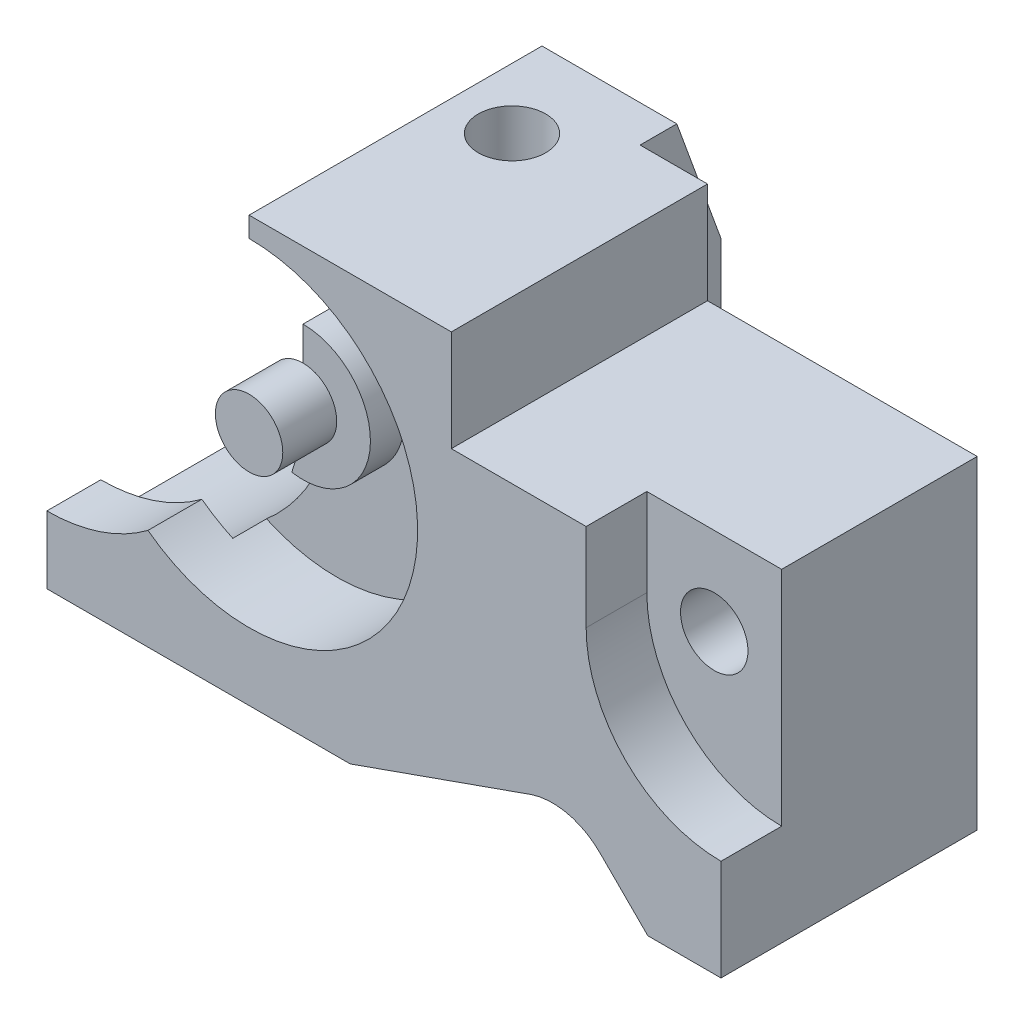
ISO-10303-21;
HEADER;
FILE_DESCRIPTION(('STEP AP214'),'2;1');
FILE_NAME('part.step','',(''),(''),'','','');
FILE_SCHEMA(('AUTOMOTIVE_DESIGN { 1 0 10303 214 1 1 1 1 }'));
ENDSEC;
DATA;
#1=APPLICATION_CONTEXT('core data for automotive mechanical design processes');
#2=APPLICATION_PROTOCOL_DEFINITION('international standard','automotive_design',2000,#1);
#3=PRODUCT_CONTEXT('',#1,'mechanical');
#4=PRODUCT('Part','Part','',(#3));
#5=PRODUCT_RELATED_PRODUCT_CATEGORY('part','',(#4));
#6=PRODUCT_DEFINITION_FORMATION('','',#4);
#7=PRODUCT_DEFINITION_CONTEXT('part definition',#1,'design');
#8=PRODUCT_DEFINITION('design','',#6,#7);
#9=PRODUCT_DEFINITION_SHAPE('','',#8);
#10=(LENGTH_UNIT() NAMED_UNIT(*) SI_UNIT(.MILLI.,.METRE.));
#11=(NAMED_UNIT(*) PLANE_ANGLE_UNIT() SI_UNIT($,.RADIAN.));
#12=(NAMED_UNIT(*) SI_UNIT($,.STERADIAN.) SOLID_ANGLE_UNIT());
#13=UNCERTAINTY_MEASURE_WITH_UNIT(LENGTH_MEASURE(1.E-05),#10,'distance_accuracy_value','');
#14=(GEOMETRIC_REPRESENTATION_CONTEXT(3) GLOBAL_UNCERTAINTY_ASSIGNED_CONTEXT((#13)) GLOBAL_UNIT_ASSIGNED_CONTEXT((#10,
#11,#12)) REPRESENTATION_CONTEXT('',''));
#15=CARTESIAN_POINT('',(0.,0.,0.));
#16=DIRECTION('',(0.,0.,1.));
#17=DIRECTION('',(1.,0.,0.));
#18=AXIS2_PLACEMENT_3D('',#15,#16,#17);
#19=CARTESIAN_POINT('',(0.,35.,50.));
#20=DIRECTION('',(0.,0.,-1.));
#21=DIRECTION('',(-1.,0.,0.));
#22=AXIS2_PLACEMENT_3D('',#19,#20,#21);
#23=CYLINDRICAL_SURFACE('',#22,30.);
#24=DIRECTION('',(0.,0.,-1.));
#25=VECTOR('',#24,1.);
#26=CARTESIAN_POINT('',(0.,5.,50.));
#27=LINE('',#26,#25);
#28=CARTESIAN_POINT('',(0.,5.,42.));
#29=VERTEX_POINT('',#28);
#30=CARTESIAN_POINT('',(0.,5.,0.));
#31=VERTEX_POINT('',#30);
#32=EDGE_CURVE('E483',#29,#31,#27,.T.);
#33=ORIENTED_EDGE('',*,*,#32,.F.);
#34=CARTESIAN_POINT('',(0.,35.,42.));
#35=DIRECTION('',(0.,0.,1.));
#36=DIRECTION('',(1.,0.,0.));
#37=AXIS2_PLACEMENT_3D('',#34,#35,#36);
#38=CIRCLE('',#37,30.);
#39=CARTESIAN_POINT('',(19.5833333333333,12.2735164278423,42.));
#40=VERTEX_POINT('',#39);
#41=EDGE_CURVE('E252',#40,#29,#38,.F.);
#42=ORIENTED_EDGE('',*,*,#41,.F.);
#43=DIRECTION('',(0.,0.,1.));
#44=VECTOR('',#43,1.);
#45=CARTESIAN_POINT('',(19.5833333333333,12.2735164278423,43.5));
#46=LINE('',#45,#44);
#47=CARTESIAN_POINT('',(19.5833333333333,12.2735164278423,37.));
#48=VERTEX_POINT('',#47);
#49=EDGE_CURVE('E285',#48,#40,#46,.T.);
#50=ORIENTED_EDGE('',*,*,#49,.F.);
#51=CARTESIAN_POINT('',(0.,35.,37.));
#52=DIRECTION('',(0.,0.,1.));
#53=DIRECTION('',(1.,0.,0.));
#54=AXIS2_PLACEMENT_3D('',#51,#52,#53);
#55=CIRCLE('',#54,30.);
#56=CARTESIAN_POINT('',(28.3333333333333,25.1398670281673,37.));
#57=VERTEX_POINT('',#56);
#58=EDGE_CURVE('E289',#48,#57,#55,.T.);
#59=ORIENTED_EDGE('',*,*,#58,.T.);
#60=DIRECTION('',(0.,0.,-1.));
#61=VECTOR('',#60,1.);
#62=CARTESIAN_POINT('',(28.3333333333333,25.1398670281673,42.));
#63=LINE('',#62,#61);
#64=CARTESIAN_POINT('',(28.3333333333333,25.1398670281673,42.));
#65=VERTEX_POINT('',#64);
#66=EDGE_CURVE('E241',#65,#57,#63,.T.);
#67=ORIENTED_EDGE('',*,*,#66,.F.);
#68=CARTESIAN_POINT('',(0.,35.,42.));
#69=DIRECTION('',(0.,0.,1.));
#70=DIRECTION('',(1.,0.,0.));
#71=AXIS2_PLACEMENT_3D('',#68,#69,#70);
#72=CIRCLE('',#71,30.);
#73=CARTESIAN_POINT('',(29.5833333333333,30.0173913570411,42.));
#74=VERTEX_POINT('',#73);
#75=EDGE_CURVE('E234',#74,#65,#72,.F.);
#76=ORIENTED_EDGE('',*,*,#75,.F.);
#77=CARTESIAN_POINT('',(30.,35.,42.));
#78=VERTEX_POINT('',#77);
#79=EDGE_CURVE('E216',#78,#74,#72,.F.);
#80=ORIENTED_EDGE('',*,*,#79,.F.);
#81=DIRECTION('',(0.,0.,-1.));
#82=VECTOR('',#81,1.);
#83=CARTESIAN_POINT('',(30.,35.,50.));
#84=LINE('',#83,#82);
#85=CARTESIAN_POINT('',(30.,35.,0.));
#86=VERTEX_POINT('',#85);
#87=EDGE_CURVE('E227',#78,#86,#84,.T.);
#88=ORIENTED_EDGE('',*,*,#87,.T.);
#89=CARTESIAN_POINT('',(0.,35.,0.));
#90=DIRECTION('',(0.,0.,1.));
#91=DIRECTION('',(1.,0.,0.));
#92=AXIS2_PLACEMENT_3D('',#89,#90,#91);
#93=CIRCLE('',#92,30.);
#94=EDGE_CURVE('E424',#31,#86,#93,.T.);
#95=ORIENTED_EDGE('',*,*,#94,.F.);
#96=EDGE_LOOP('',(#33,#42,#50,#59,#67,#76,#80,#88,#95));
#97=FACE_BOUND('',#96,.T.);
#98=ADVANCED_FACE('F41',(#97),#23,.F.);
#99=CARTESIAN_POINT('',(0.,0.,50.));
#100=DIRECTION('',(-1.,0.,0.));
#101=DIRECTION('',(0.,0.,1.));
#102=AXIS2_PLACEMENT_3D('',#99,#100,#101);
#103=PLANE('',#102);
#104=DIRECTION('',(0.,1.,0.));
#105=VECTOR('',#104,1.);
#106=CARTESIAN_POINT('',(0.,0.,0.));
#107=LINE('',#106,#105);
#108=CARTESIAN_POINT('',(0.,0.,0.));
#109=VERTEX_POINT('',#108);
#110=EDGE_CURVE('E428',#109,#31,#107,.T.);
#111=ORIENTED_EDGE('',*,*,#110,.F.);
#112=DIRECTION('',(0.,0.,-1.));
#113=VECTOR('',#112,1.);
#114=CARTESIAN_POINT('',(0.,0.,50.));
#115=LINE('',#114,#113);
#116=CARTESIAN_POINT('',(0.,0.,50.));
#117=VERTEX_POINT('',#116);
#118=EDGE_CURVE('E480',#117,#109,#115,.T.);
#119=ORIENTED_EDGE('',*,*,#118,.F.);
#120=DIRECTION('',(0.,1.,0.));
#121=VECTOR('',#120,1.);
#122=CARTESIAN_POINT('',(0.,0.,50.));
#123=LINE('',#122,#121);
#124=CARTESIAN_POINT('',(0.,10.,50.));
#125=VERTEX_POINT('',#124);
#126=EDGE_CURVE('E386',#117,#125,#123,.T.);
#127=ORIENTED_EDGE('',*,*,#126,.T.);
#128=DIRECTION('',(0.,0.,1.));
#129=VECTOR('',#128,1.);
#130=CARTESIAN_POINT('',(0.,10.,42.));
#131=LINE('',#130,#129);
#132=CARTESIAN_POINT('',(0.,10.,42.));
#133=VERTEX_POINT('',#132);
#134=EDGE_CURVE('E270',#133,#125,#131,.T.);
#135=ORIENTED_EDGE('',*,*,#134,.F.);
#136=DIRECTION('',(0.,1.,0.));
#137=VECTOR('',#136,1.);
#138=CARTESIAN_POINT('',(0.,0.,42.));
#139=LINE('',#138,#137);
#140=EDGE_CURVE('E263',#29,#133,#139,.T.);
#141=ORIENTED_EDGE('',*,*,#140,.F.);
#142=ORIENTED_EDGE('',*,*,#32,.T.);
#143=EDGE_LOOP('',(#111,#119,#127,#135,#141,#142));
#144=FACE_BOUND('',#143,.T.);
#145=ADVANCED_FACE('F588',(#144),#103,.T.);
#146=CARTESIAN_POINT('',(0.,0.,50.));
#147=DIRECTION('',(0.,1.,0.));
#148=DIRECTION('',(0.,0.,1.));
#149=AXIS2_PLACEMENT_3D('',#146,#147,#148);
#150=PLANE('',#149);
#151=CARTESIAN_POINT('',(39.,0.,20.));
#152=DIRECTION('',(0.,1.,0.));
#153=DIRECTION('',(0.,0.,1.));
#154=AXIS2_PLACEMENT_3D('',#151,#152,#153);
#155=CIRCLE('',#154,5.);
#156=CARTESIAN_POINT('',(39.,0.,25.));
#157=VERTEX_POINT('',#156);
#158=EDGE_CURVE('E349',#157,#157,#155,.T.);
#159=ORIENTED_EDGE('',*,*,#158,.T.);
#160=EDGE_LOOP('',(#159));
#161=FACE_BOUND('',#160,.T.);
#162=DIRECTION('',(1.,0.,0.));
#163=VECTOR('',#162,1.);
#164=CARTESIAN_POINT('',(0.,0.,0.));
#165=LINE('',#164,#163);
#166=CARTESIAN_POINT('',(45.,0.,0.));
#167=VERTEX_POINT('',#166);
#168=EDGE_CURVE('E432',#109,#167,#165,.T.);
#169=ORIENTED_EDGE('',*,*,#168,.T.);
#170=DIRECTION('',(0.,0.,-1.));
#171=VECTOR('',#170,1.);
#172=CARTESIAN_POINT('',(45.,0.,50.));
#173=LINE('',#172,#171);
#174=CARTESIAN_POINT('',(45.,0.,50.));
#175=VERTEX_POINT('',#174);
#176=EDGE_CURVE('E476',#175,#167,#173,.T.);
#177=ORIENTED_EDGE('',*,*,#176,.F.);
#178=DIRECTION('',(1.,0.,0.));
#179=VECTOR('',#178,1.);
#180=CARTESIAN_POINT('',(0.,0.,50.));
#181=LINE('',#180,#179);
#182=EDGE_CURVE('E389',#117,#175,#181,.T.);
#183=ORIENTED_EDGE('',*,*,#182,.F.);
#184=ORIENTED_EDGE('',*,*,#118,.T.);
#185=EDGE_LOOP('',(#169,#177,#183,#184));
#186=FACE_BOUND('',#185,.T.);
#187=ADVANCED_FACE('F592',(#161,#186),#150,.F.);
#188=CARTESIAN_POINT('',(4.99773010518774,-14.1393263110075,50.));
#189=DIRECTION('',(-0.333257661583604,0.942835792169468,0.));
#190=DIRECTION('',(-0.942835792169468,-0.333257661583604,0.));
#191=AXIS2_PLACEMENT_3D('',#188,#189,#190);
#192=PLANE('',#191);
#193=DIRECTION('',(0.,0.,1.));
#194=VECTOR('',#193,1.);
#195=CARTESIAN_POINT('',(50.,1.76731549836888,50.));
#196=LINE('',#195,#194);
#197=CARTESIAN_POINT('',(50.,1.76731549836889,0.));
#198=VERTEX_POINT('',#197);
#199=CARTESIAN_POINT('',(50.,1.76731549836889,12.));
#200=VERTEX_POINT('',#199);
#201=EDGE_CURVE('E316',#198,#200,#196,.T.);
#202=ORIENTED_EDGE('',*,*,#201,.T.);
#203=DIRECTION('',(0.942835792169468,0.333257661583604,0.));
#204=VECTOR('',#203,1.);
#205=CARTESIAN_POINT('',(4.99773010518773,-14.1393263110075,12.));
#206=LINE('',#205,#204);
#207=CARTESIAN_POINT('',(71.8690678974508,9.49722402437821,12.));
#208=VERTEX_POINT('',#207);
#209=EDGE_CURVE('E341',#200,#208,#206,.T.);
#210=ORIENTED_EDGE('',*,*,#209,.T.);
#211=DIRECTION('',(0.,0.,-1.));
#212=VECTOR('',#211,1.);
#213=CARTESIAN_POINT('',(71.8690678974508,9.49722402437821,50.));
#214=LINE('',#213,#212);
#215=CARTESIAN_POINT('',(71.8690678974508,9.49722402437821,50.));
#216=VERTEX_POINT('',#215);
#217=EDGE_CURVE('E472',#216,#208,#214,.T.);
#218=ORIENTED_EDGE('',*,*,#217,.F.);
#219=DIRECTION('',(0.942835792169468,0.333257661583604,0.));
#220=VECTOR('',#219,1.);
#221=CARTESIAN_POINT('',(4.99773010518774,-14.1393263110075,50.));
#222=LINE('',#221,#220);
#223=EDGE_CURVE('E393',#175,#216,#222,.T.);
#224=ORIENTED_EDGE('',*,*,#223,.F.);
#225=ORIENTED_EDGE('',*,*,#176,.T.);
#226=DIRECTION('',(0.942835792169468,0.333257661583604,0.));
#227=VECTOR('',#226,1.);
#228=CARTESIAN_POINT('',(4.99773010518774,-14.1393263110075,0.));
#229=LINE('',#228,#227);
#230=EDGE_CURVE('E435',#167,#198,#229,.T.);
#231=ORIENTED_EDGE('',*,*,#230,.T.);
#232=EDGE_LOOP('',(#202,#210,#218,#224,#225,#231));
#233=FACE_BOUND('',#232,.T.);
#234=ADVANCED_FACE('F539',(#233),#192,.F.);
#235=CARTESIAN_POINT('',(75.,0.,50.));
#236=DIRECTION('',(0.,0.,-1.));
#237=DIRECTION('',(-1.,0.,0.));
#238=AXIS2_PLACEMENT_3D('',#235,#236,#237);
#239=CYLINDRICAL_SURFACE('',#238,10.);
#240=CARTESIAN_POINT('',(75.,0.,12.));
#241=DIRECTION('',(0.,0.,1.));
#242=DIRECTION('',(1.,0.,0.));
#243=AXIS2_PLACEMENT_3D('',#240,#241,#242);
#244=CIRCLE('',#243,10.);
#245=CARTESIAN_POINT('',(82.0710678118654,7.07106781186552,12.));
#246=VERTEX_POINT('',#245);
#247=EDGE_CURVE('E338',#246,#208,#244,.T.);
#248=ORIENTED_EDGE('',*,*,#247,.F.);
#249=DIRECTION('',(0.,0.,-1.));
#250=VECTOR('',#249,1.);
#251=CARTESIAN_POINT('',(82.0710678118654,7.07106781186552,50.));
#252=LINE('',#251,#250);
#253=CARTESIAN_POINT('',(82.0710678118654,7.07106781186552,50.));
#254=VERTEX_POINT('',#253);
#255=EDGE_CURVE('E468',#254,#246,#252,.T.);
#256=ORIENTED_EDGE('',*,*,#255,.F.);
#257=CARTESIAN_POINT('',(75.,0.,50.));
#258=DIRECTION('',(0.,0.,1.));
#259=DIRECTION('',(1.,0.,0.));
#260=AXIS2_PLACEMENT_3D('',#257,#258,#259);
#261=CIRCLE('',#260,10.);
#262=EDGE_CURVE('E396',#254,#216,#261,.T.);
#263=ORIENTED_EDGE('',*,*,#262,.T.);
#264=ORIENTED_EDGE('',*,*,#217,.T.);
#265=EDGE_LOOP('',(#248,#256,#263,#264));
#266=FACE_BOUND('',#265,.T.);
#267=ADVANCED_FACE('F542',(#266),#239,.F.);
#268=CARTESIAN_POINT('',(44.5710678118651,44.5710678118655,50.));
#269=DIRECTION('',(-0.707106781186544,-0.707106781186551,0.));
#270=DIRECTION('',(0.707106781186551,-0.707106781186544,0.));
#271=AXIS2_PLACEMENT_3D('',#268,#269,#270);
#272=PLANE('',#271);
#273=DIRECTION('',(-0.707106781186551,0.707106781186544,0.));
#274=VECTOR('',#273,1.);
#275=CARTESIAN_POINT('',(44.5710678118651,44.5710678118655,12.));
#276=LINE('',#275,#274);
#277=CARTESIAN_POINT('',(89.142135623731,0.,12.));
#278=VERTEX_POINT('',#277);
#279=EDGE_CURVE('E335',#278,#246,#276,.T.);
#280=ORIENTED_EDGE('',*,*,#279,.F.);
#281=DIRECTION('',(0.,0.,-1.));
#282=VECTOR('',#281,1.);
#283=CARTESIAN_POINT('',(89.142135623731,0.,50.));
#284=LINE('',#283,#282);
#285=CARTESIAN_POINT('',(89.142135623731,0.,50.));
#286=VERTEX_POINT('',#285);
#287=EDGE_CURVE('E464',#286,#278,#284,.T.);
#288=ORIENTED_EDGE('',*,*,#287,.F.);
#289=DIRECTION('',(-0.707106781186551,0.707106781186544,0.));
#290=VECTOR('',#289,1.);
#291=CARTESIAN_POINT('',(44.5710678118651,44.5710678118655,50.));
#292=LINE('',#291,#290);
#293=EDGE_CURVE('E400',#286,#254,#292,.T.);
#294=ORIENTED_EDGE('',*,*,#293,.T.);
#295=ORIENTED_EDGE('',*,*,#255,.T.);
#296=EDGE_LOOP('',(#280,#288,#294,#295));
#297=FACE_BOUND('',#296,.T.);
#298=ADVANCED_FACE('F547',(#297),#272,.T.);
#299=CARTESIAN_POINT('',(0.,0.,50.));
#300=DIRECTION('',(0.,1.,0.));
#301=DIRECTION('',(0.,0.,1.));
#302=AXIS2_PLACEMENT_3D('',#299,#300,#301);
#303=PLANE('',#302);
#304=ORIENTED_EDGE('',*,*,#287,.T.);
#305=DIRECTION('',(1.,0.,0.));
#306=VECTOR('',#305,1.);
#307=CARTESIAN_POINT('',(0.,0.,12.));
#308=LINE('',#307,#306);
#309=CARTESIAN_POINT('',(100.,0.,12.));
#310=VERTEX_POINT('',#309);
#311=EDGE_CURVE('E331',#278,#310,#308,.T.);
#312=ORIENTED_EDGE('',*,*,#311,.T.);
#313=DIRECTION('',(0.,0.,-1.));
#314=VECTOR('',#313,1.);
#315=CARTESIAN_POINT('',(100.,0.,50.));
#316=LINE('',#315,#314);
#317=CARTESIAN_POINT('',(100.,0.,50.));
#318=VERTEX_POINT('',#317);
#319=EDGE_CURVE('E460',#318,#310,#316,.T.);
#320=ORIENTED_EDGE('',*,*,#319,.F.);
#321=DIRECTION('',(1.,0.,0.));
#322=VECTOR('',#321,1.);
#323=CARTESIAN_POINT('',(0.,0.,50.));
#324=LINE('',#323,#322);
#325=EDGE_CURVE('E404',#286,#318,#324,.T.);
#326=ORIENTED_EDGE('',*,*,#325,.F.);
#327=EDGE_LOOP('',(#304,#312,#320,#326));
#328=FACE_BOUND('',#327,.T.);
#329=ADVANCED_FACE('F551',(#328),#303,.F.);
#330=CARTESIAN_POINT('',(100.,0.,50.));
#331=DIRECTION('',(-1.,0.,0.));
#332=DIRECTION('',(0.,0.,1.));
#333=AXIS2_PLACEMENT_3D('',#330,#331,#332);
#334=PLANE('',#333);
#335=ORIENTED_EDGE('',*,*,#319,.T.);
#336=DIRECTION('',(0.,1.,0.));
#337=VECTOR('',#336,1.);
#338=CARTESIAN_POINT('',(100.,-34.,12.));
#339=LINE('',#338,#337);
#340=CARTESIAN_POINT('',(100.,48.,12.));
#341=VERTEX_POINT('',#340);
#342=EDGE_CURVE('E326',#310,#341,#339,.T.);
#343=ORIENTED_EDGE('',*,*,#342,.T.);
#344=DIRECTION('',(0.,0.,-1.));
#345=VECTOR('',#344,1.);
#346=CARTESIAN_POINT('',(100.,48.,50.));
#347=LINE('',#346,#345);
#348=CARTESIAN_POINT('',(100.,48.,41.));
#349=VERTEX_POINT('',#348);
#350=EDGE_CURVE('E456',#349,#341,#347,.T.);
#351=ORIENTED_EDGE('',*,*,#350,.F.);
#352=DIRECTION('',(0.,1.,0.));
#353=VECTOR('',#352,1.);
#354=CARTESIAN_POINT('',(100.,48.,41.));
#355=LINE('',#354,#353);
#356=CARTESIAN_POINT('',(100.,15.,41.));
#357=VERTEX_POINT('',#356);
#358=EDGE_CURVE('E354',#357,#349,#355,.T.);
#359=ORIENTED_EDGE('',*,*,#358,.F.);
#360=DIRECTION('',(0.,0.,1.));
#361=VECTOR('',#360,1.);
#362=CARTESIAN_POINT('',(100.,15.,41.));
#363=LINE('',#362,#361);
#364=CARTESIAN_POINT('',(100.,15.,50.));
#365=VERTEX_POINT('',#364);
#366=EDGE_CURVE('E376',#357,#365,#363,.T.);
#367=ORIENTED_EDGE('',*,*,#366,.T.);
#368=DIRECTION('',(0.,1.,0.));
#369=VECTOR('',#368,1.);
#370=CARTESIAN_POINT('',(100.,0.,50.));
#371=LINE('',#370,#369);
#372=EDGE_CURVE('E407',#318,#365,#371,.T.);
#373=ORIENTED_EDGE('',*,*,#372,.F.);
#374=EDGE_LOOP('',(#335,#343,#351,#359,#367,#373));
#375=FACE_BOUND('',#374,.T.);
#376=ADVANCED_FACE('F556',(#375),#334,.F.);
#377=CARTESIAN_POINT('',(0.,48.,50.));
#378=DIRECTION('',(0.,-1.,0.));
#379=DIRECTION('',(1.,0.,0.));
#380=AXIS2_PLACEMENT_3D('',#377,#378,#379);
#381=PLANE('',#380);
#382=ORIENTED_EDGE('',*,*,#350,.T.);
#383=DIRECTION('',(1.,0.,0.));
#384=VECTOR('',#383,1.);
#385=CARTESIAN_POINT('',(100.,48.,12.));
#386=LINE('',#385,#384);
#387=CARTESIAN_POINT('',(60.,48.,12.));
#388=VERTEX_POINT('',#387);
#389=EDGE_CURVE('E323',#388,#341,#386,.T.);
#390=ORIENTED_EDGE('',*,*,#389,.F.);
#391=DIRECTION('',(0.,0.,-1.));
#392=VECTOR('',#391,1.);
#393=CARTESIAN_POINT('',(60.,48.,50.));
#394=LINE('',#393,#392);
#395=CARTESIAN_POINT('',(60.,48.,50.));
#396=VERTEX_POINT('',#395);
#397=EDGE_CURVE('E452',#396,#388,#394,.T.);
#398=ORIENTED_EDGE('',*,*,#397,.F.);
#399=DIRECTION('',(-1.,0.,0.));
#400=VECTOR('',#399,1.);
#401=CARTESIAN_POINT('',(0.,48.,50.));
#402=LINE('',#401,#400);
#403=CARTESIAN_POINT('',(80.,48.,50.));
#404=VERTEX_POINT('',#403);
#405=EDGE_CURVE('E411',#404,#396,#402,.T.);
#406=ORIENTED_EDGE('',*,*,#405,.F.);
#407=DIRECTION('',(0.,0.,1.));
#408=VECTOR('',#407,1.);
#409=CARTESIAN_POINT('',(80.,48.,41.));
#410=LINE('',#409,#408);
#411=CARTESIAN_POINT('',(80.,48.,41.));
#412=VERTEX_POINT('',#411);
#413=EDGE_CURVE('E370',#412,#404,#410,.T.);
#414=ORIENTED_EDGE('',*,*,#413,.F.);
#415=DIRECTION('',(-1.,0.,0.));
#416=VECTOR('',#415,1.);
#417=CARTESIAN_POINT('',(80.,48.,41.));
#418=LINE('',#417,#416);
#419=EDGE_CURVE('E357',#349,#412,#418,.T.);
#420=ORIENTED_EDGE('',*,*,#419,.F.);
#421=EDGE_LOOP('',(#382,#390,#398,#406,#414,#420));
#422=FACE_BOUND('',#421,.T.);
#423=ADVANCED_FACE('F572',(#422),#381,.F.);
#424=CARTESIAN_POINT('',(60.,0.,50.));
#425=DIRECTION('',(-1.,0.,0.));
#426=DIRECTION('',(0.,0.,1.));
#427=AXIS2_PLACEMENT_3D('',#424,#425,#426);
#428=PLANE('',#427);
#429=ORIENTED_EDGE('',*,*,#397,.T.);
#430=DIRECTION('',(0.,1.,0.));
#431=VECTOR('',#430,1.);
#432=CARTESIAN_POINT('',(60.,-19.,12.));
#433=LINE('',#432,#431);
#434=CARTESIAN_POINT('',(60.,63.,12.));
#435=VERTEX_POINT('',#434);
#436=EDGE_CURVE('E312',#388,#435,#433,.T.);
#437=ORIENTED_EDGE('',*,*,#436,.T.);
#438=DIRECTION('',(0.,0.,-1.));
#439=VECTOR('',#438,1.);
#440=CARTESIAN_POINT('',(60.,63.,50.));
#441=LINE('',#440,#439);
#442=CARTESIAN_POINT('',(60.,63.,50.));
#443=VERTEX_POINT('',#442);
#444=EDGE_CURVE('E448',#443,#435,#441,.T.);
#445=ORIENTED_EDGE('',*,*,#444,.F.);
#446=DIRECTION('',(0.,1.,0.));
#447=VECTOR('',#446,1.);
#448=CARTESIAN_POINT('',(60.,0.,50.));
#449=LINE('',#448,#447);
#450=EDGE_CURVE('E414',#396,#443,#449,.T.);
#451=ORIENTED_EDGE('',*,*,#450,.F.);
#452=EDGE_LOOP('',(#429,#437,#445,#451));
#453=FACE_BOUND('',#452,.T.);
#454=ADVANCED_FACE('F577',(#453),#428,.F.);
#455=CARTESIAN_POINT('',(0.,63.,50.));
#456=DIRECTION('',(0.,-1.,0.));
#457=DIRECTION('',(1.,0.,0.));
#458=AXIS2_PLACEMENT_3D('',#455,#456,#457);
#459=PLANE('',#458);
#460=CARTESIAN_POINT('',(39.,63.,20.));
#461=DIRECTION('',(0.,1.,0.));
#462=DIRECTION('',(-1.,0.,0.));
#463=AXIS2_PLACEMENT_3D('',#460,#461,#462);
#464=CIRCLE('',#463,5.);
#465=CARTESIAN_POINT('',(34.,63.,20.));
#466=VERTEX_POINT('',#465);
#467=EDGE_CURVE('E345',#466,#466,#464,.T.);
#468=ORIENTED_EDGE('',*,*,#467,.F.);
#469=EDGE_LOOP('',(#468));
#470=FACE_BOUND('',#469,.T.);
#471=DIRECTION('',(0.,0.,1.));
#472=VECTOR('',#471,1.);
#473=CARTESIAN_POINT('',(50.,63.,0.));
#474=LINE('',#473,#472);
#475=CARTESIAN_POINT('',(50.,63.,6.55146421679152));
#476=VERTEX_POINT('',#475);
#477=CARTESIAN_POINT('',(50.,63.,12.));
#478=VERTEX_POINT('',#477);
#479=EDGE_CURVE('E305',#476,#478,#474,.T.);
#480=ORIENTED_EDGE('',*,*,#479,.F.);
#481=DIRECTION('',(1.,0.,0.));
#482=VECTOR('',#481,1.);
#483=CARTESIAN_POINT('',(-32.,63.,6.55146421679152));
#484=LINE('',#483,#482);
#485=CARTESIAN_POINT('',(30.,63.,6.55146421679152));
#486=VERTEX_POINT('',#485);
#487=EDGE_CURVE('E63',#486,#476,#484,.T.);
#488=ORIENTED_EDGE('',*,*,#487,.F.);
#489=DIRECTION('',(0.,0.,-1.));
#490=VECTOR('',#489,1.);
#491=CARTESIAN_POINT('',(30.,63.,50.));
#492=LINE('',#491,#490);
#493=CARTESIAN_POINT('',(30.,63.,50.));
#494=VERTEX_POINT('',#493);
#495=EDGE_CURVE('E444',#494,#486,#492,.T.);
#496=ORIENTED_EDGE('',*,*,#495,.F.);
#497=DIRECTION('',(-1.,0.,0.));
#498=VECTOR('',#497,1.);
#499=CARTESIAN_POINT('',(0.,63.,50.));
#500=LINE('',#499,#498);
#501=EDGE_CURVE('E417',#443,#494,#500,.T.);
#502=ORIENTED_EDGE('',*,*,#501,.F.);
#503=ORIENTED_EDGE('',*,*,#444,.T.);
#504=DIRECTION('',(1.,0.,0.));
#505=VECTOR('',#504,1.);
#506=CARTESIAN_POINT('',(60.,63.,12.));
#507=LINE('',#506,#505);
#508=EDGE_CURVE('E308',#478,#435,#507,.T.);
#509=ORIENTED_EDGE('',*,*,#508,.F.);
#510=EDGE_LOOP('',(#480,#488,#496,#502,#503,#509));
#511=FACE_BOUND('',#510,.T.);
#512=ADVANCED_FACE('F527',(#470,#511),#459,.F.);
#513=CARTESIAN_POINT('',(30.,0.,50.));
#514=DIRECTION('',(-1.,0.,0.));
#515=DIRECTION('',(0.,0.,1.));
#516=AXIS2_PLACEMENT_3D('',#513,#514,#515);
#517=PLANE('',#516);
#518=DIRECTION('',(0.,0.,1.));
#519=VECTOR('',#518,1.);
#520=CARTESIAN_POINT('',(30.,60.,37.));
#521=LINE('',#520,#519);
#522=CARTESIAN_POINT('',(30.,60.,50.));
#523=VERTEX_POINT('',#522);
#524=CARTESIAN_POINT('',(30.,60.,37.));
#525=VERTEX_POINT('',#524);
#526=EDGE_CURVE('E281',#523,#525,#521,.F.);
#527=ORIENTED_EDGE('',*,*,#526,.F.);
#528=DIRECTION('',(0.,1.,0.));
#529=VECTOR('',#528,1.);
#530=CARTESIAN_POINT('',(30.,0.,50.));
#531=LINE('',#530,#529);
#532=EDGE_CURVE('E421',#523,#494,#531,.T.);
#533=ORIENTED_EDGE('',*,*,#532,.T.);
#534=ORIENTED_EDGE('',*,*,#495,.T.);
#535=DIRECTION('',(0.,0.93969262078591,0.342020143325663));
#536=VECTOR('',#535,1.);
#537=CARTESIAN_POINT('',(30.,21.3336902719861,-8.61383229592158));
#538=LINE('',#537,#536);
#539=CARTESIAN_POINT('',(30.,45.,0.));
#540=VERTEX_POINT('',#539);
#541=EDGE_CURVE('E300',#540,#486,#538,.T.);
#542=ORIENTED_EDGE('',*,*,#541,.F.);
#543=DIRECTION('',(0.,1.,0.));
#544=VECTOR('',#543,1.);
#545=CARTESIAN_POINT('',(30.,0.,0.));
#546=LINE('',#545,#544);
#547=EDGE_CURVE('E390',#86,#540,#546,.T.);
#548=ORIENTED_EDGE('',*,*,#547,.F.);
#549=ORIENTED_EDGE('',*,*,#87,.F.);
#550=DIRECTION('',(0.,-1.,0.));
#551=VECTOR('',#550,1.);
#552=CARTESIAN_POINT('',(30.,0.,42.));
#553=LINE('',#552,#551);
#554=CARTESIAN_POINT('',(30.,40.,42.));
#555=VERTEX_POINT('',#554);
#556=EDGE_CURVE('E213',#555,#78,#553,.T.);
#557=ORIENTED_EDGE('',*,*,#556,.F.);
#558=CARTESIAN_POINT('',(30.,45.,42.));
#559=VERTEX_POINT('',#558);
#560=EDGE_CURVE('E224',#559,#555,#553,.T.);
#561=ORIENTED_EDGE('',*,*,#560,.F.);
#562=DIRECTION('',(0.,0.,-1.));
#563=VECTOR('',#562,1.);
#564=CARTESIAN_POINT('',(30.,45.,42.));
#565=LINE('',#564,#563);
#566=CARTESIAN_POINT('',(30.,45.,37.));
#567=VERTEX_POINT('',#566);
#568=EDGE_CURVE('E248',#559,#567,#565,.T.);
#569=ORIENTED_EDGE('',*,*,#568,.T.);
#570=DIRECTION('',(0.,1.,0.));
#571=VECTOR('',#570,1.);
#572=CARTESIAN_POINT('',(30.,0.,37.));
#573=LINE('',#572,#571);
#574=EDGE_CURVE('E49',#567,#525,#573,.T.);
#575=ORIENTED_EDGE('',*,*,#574,.T.);
#576=EDGE_LOOP('',(#527,#533,#534,#542,#548,#549,#557,#561,#569,#575));
#577=FACE_BOUND('',#576,.T.);
#578=ADVANCED_FACE('F223',(#577),#517,.T.);
#579=CARTESIAN_POINT('',(0.,0.,50.));
#580=DIRECTION('',(0.,0.,1.));
#581=DIRECTION('',(1.,0.,0.));
#582=AXIS2_PLACEMENT_3D('',#579,#580,#581);
#583=PLANE('',#582);
#584=CARTESIAN_POINT('',(30.,35.,50.));
#585=DIRECTION('',(0.,0.,1.));
#586=DIRECTION('',(1.,0.,0.));
#587=AXIS2_PLACEMENT_3D('',#584,#585,#586);
#588=CIRCLE('',#587,25.);
#589=CARTESIAN_POINT('',(15.,15.,50.));
#590=VERTEX_POINT('',#589);
#591=EDGE_CURVE('E495',#590,#523,#588,.T.);
#592=ORIENTED_EDGE('',*,*,#591,.F.);
#593=CARTESIAN_POINT('',(0.,35.,50.));
#594=DIRECTION('',(0.,0.,1.));
#595=DIRECTION('',(1.,0.,0.));
#596=AXIS2_PLACEMENT_3D('',#593,#594,#595);
#597=CIRCLE('',#596,25.);
#598=EDGE_CURVE('E251',#125,#590,#597,.T.);
#599=ORIENTED_EDGE('',*,*,#598,.F.);
#600=ORIENTED_EDGE('',*,*,#126,.F.);
#601=ORIENTED_EDGE('',*,*,#182,.T.);
#602=ORIENTED_EDGE('',*,*,#223,.T.);
#603=ORIENTED_EDGE('',*,*,#262,.F.);
#604=ORIENTED_EDGE('',*,*,#293,.F.);
#605=ORIENTED_EDGE('',*,*,#325,.T.);
#606=ORIENTED_EDGE('',*,*,#372,.T.);
#607=CARTESIAN_POINT('',(100.,35.,50.));
#608=DIRECTION('',(0.,0.,1.));
#609=DIRECTION('',(-1.,0.,0.));
#610=AXIS2_PLACEMENT_3D('',#607,#608,#609);
#611=CIRCLE('',#610,20.);
#612=CARTESIAN_POINT('',(80.,35.,50.));
#613=VERTEX_POINT('',#612);
#614=EDGE_CURVE('E358',#613,#365,#611,.T.);
#615=ORIENTED_EDGE('',*,*,#614,.F.);
#616=DIRECTION('',(0.,-1.,0.));
#617=VECTOR('',#616,1.);
#618=CARTESIAN_POINT('',(80.,35.,50.));
#619=LINE('',#618,#617);
#620=EDGE_CURVE('E353',#404,#613,#619,.T.);
#621=ORIENTED_EDGE('',*,*,#620,.F.);
#622=ORIENTED_EDGE('',*,*,#405,.T.);
#623=ORIENTED_EDGE('',*,*,#450,.T.);
#624=ORIENTED_EDGE('',*,*,#501,.T.);
#625=ORIENTED_EDGE('',*,*,#532,.F.);
#626=EDGE_LOOP('',(#592,#599,#600,#601,#602,#603,#604,#605,#606,#615,#621,#622,#623,#624,#625));
#627=FACE_BOUND('',#626,.T.);
#628=ADVANCED_FACE('F521',(#627),#583,.T.);
#629=CARTESIAN_POINT('',(0.,0.,0.));
#630=DIRECTION('',(0.,0.,1.));
#631=DIRECTION('',(1.,0.,0.));
#632=AXIS2_PLACEMENT_3D('',#629,#630,#631);
#633=PLANE('',#632);
#634=ORIENTED_EDGE('',*,*,#547,.T.);
#635=DIRECTION('',(1.,0.,0.));
#636=VECTOR('',#635,1.);
#637=CARTESIAN_POINT('',(-32.,45.,0.));
#638=LINE('',#637,#636);
#639=CARTESIAN_POINT('',(50.,45.,0.));
#640=VERTEX_POINT('',#639);
#641=EDGE_CURVE('E296',#540,#640,#638,.T.);
#642=ORIENTED_EDGE('',*,*,#641,.T.);
#643=DIRECTION('',(0.,-1.,0.));
#644=VECTOR('',#643,1.);
#645=CARTESIAN_POINT('',(50.,0.,0.));
#646=LINE('',#645,#644);
#647=EDGE_CURVE('E486',#640,#198,#646,.T.);
#648=ORIENTED_EDGE('',*,*,#647,.T.);
#649=ORIENTED_EDGE('',*,*,#230,.F.);
#650=ORIENTED_EDGE('',*,*,#168,.F.);
#651=ORIENTED_EDGE('',*,*,#110,.T.);
#652=ORIENTED_EDGE('',*,*,#94,.T.);
#653=EDGE_LOOP('',(#634,#642,#648,#649,#650,#651,#652));
#654=FACE_BOUND('',#653,.T.);
#655=ADVANCED_FACE('F655',(#654),#633,.F.);
#656=CARTESIAN_POINT('',(90.,35.,-14.));
#657=DIRECTION('',(0.,0.,1.));
#658=DIRECTION('',(1.,0.,0.));
#659=AXIS2_PLACEMENT_3D('',#656,#657,#658);
#660=CYLINDRICAL_SURFACE('',#659,5.00000000000001);
#661=CARTESIAN_POINT('',(90.,35.,12.));
#662=DIRECTION('',(0.,0.,1.));
#663=DIRECTION('',(1.,0.,0.));
#664=AXIS2_PLACEMENT_3D('',#661,#662,#663);
#665=CIRCLE('',#664,5.00000000000001);
#666=CARTESIAN_POINT('',(95.,35.,12.));
#667=VERTEX_POINT('',#666);
#668=EDGE_CURVE('E330',#667,#667,#665,.F.);
#669=ORIENTED_EDGE('',*,*,#668,.T.);
#670=EDGE_LOOP('',(#669));
#671=FACE_BOUND('',#670,.T.);
#672=CARTESIAN_POINT('',(90.,35.,41.));
#673=DIRECTION('',(0.,0.,-1.));
#674=DIRECTION('',(-1.,0.,0.));
#675=AXIS2_PLACEMENT_3D('',#672,#673,#674);
#676=CIRCLE('',#675,5.00000000000001);
#677=CARTESIAN_POINT('',(85.,35.,41.));
#678=VERTEX_POINT('',#677);
#679=EDGE_CURVE('E380',#678,#678,#676,.F.);
#680=ORIENTED_EDGE('',*,*,#679,.T.);
#681=EDGE_LOOP('',(#680));
#682=FACE_BOUND('',#681,.T.);
#683=ADVANCED_FACE('F660',(#671,#682),#660,.F.);
#684=CARTESIAN_POINT('',(100.,35.,41.));
#685=DIRECTION('',(0.,0.,-1.));
#686=DIRECTION('',(-1.,0.,0.));
#687=AXIS2_PLACEMENT_3D('',#684,#685,#686);
#688=PLANE('',#687);
#689=ORIENTED_EDGE('',*,*,#358,.T.);
#690=ORIENTED_EDGE('',*,*,#419,.T.);
#691=DIRECTION('',(0.,-1.,0.));
#692=VECTOR('',#691,1.);
#693=CARTESIAN_POINT('',(80.,35.,41.));
#694=LINE('',#693,#692);
#695=CARTESIAN_POINT('',(80.,35.,41.));
#696=VERTEX_POINT('',#695);
#697=EDGE_CURVE('E362',#412,#696,#694,.T.);
#698=ORIENTED_EDGE('',*,*,#697,.T.);
#699=CARTESIAN_POINT('',(100.,35.,41.));
#700=DIRECTION('',(0.,0.,1.));
#701=DIRECTION('',(-1.,0.,0.));
#702=AXIS2_PLACEMENT_3D('',#699,#700,#701);
#703=CIRCLE('',#702,20.);
#704=EDGE_CURVE('E366',#696,#357,#703,.T.);
#705=ORIENTED_EDGE('',*,*,#704,.T.);
#706=EDGE_LOOP('',(#689,#690,#698,#705));
#707=FACE_BOUND('',#706,.T.);
#708=ORIENTED_EDGE('',*,*,#679,.F.);
#709=EDGE_LOOP('',(#708));
#710=FACE_BOUND('',#709,.T.);
#711=ADVANCED_FACE('F563',(#707,#710),#688,.F.);
#712=CARTESIAN_POINT('',(100.,35.,41.));
#713=DIRECTION('',(0.,0.,1.));
#714=DIRECTION('',(1.,0.,0.));
#715=AXIS2_PLACEMENT_3D('',#712,#713,#714);
#716=CYLINDRICAL_SURFACE('',#715,20.);
#717=ORIENTED_EDGE('',*,*,#614,.T.);
#718=ORIENTED_EDGE('',*,*,#366,.F.);
#719=ORIENTED_EDGE('',*,*,#704,.F.);
#720=DIRECTION('',(0.,0.,1.));
#721=VECTOR('',#720,1.);
#722=CARTESIAN_POINT('',(80.,35.,41.));
#723=LINE('',#722,#721);
#724=EDGE_CURVE('E381',#696,#613,#723,.T.);
#725=ORIENTED_EDGE('',*,*,#724,.T.);
#726=EDGE_LOOP('',(#717,#718,#719,#725));
#727=FACE_BOUND('',#726,.T.);
#728=ADVANCED_FACE('F561',(#727),#716,.F.);
#729=CARTESIAN_POINT('',(80.,35.,41.));
#730=DIRECTION('',(-1.,0.,0.));
#731=DIRECTION('',(0.,0.,1.));
#732=AXIS2_PLACEMENT_3D('',#729,#730,#731);
#733=PLANE('',#732);
#734=ORIENTED_EDGE('',*,*,#620,.T.);
#735=ORIENTED_EDGE('',*,*,#724,.F.);
#736=ORIENTED_EDGE('',*,*,#697,.F.);
#737=ORIENTED_EDGE('',*,*,#413,.T.);
#738=EDGE_LOOP('',(#734,#735,#736,#737));
#739=FACE_BOUND('',#738,.T.);
#740=ADVANCED_FACE('F568',(#739),#733,.F.);
#741=CARTESIAN_POINT('',(39.,-19.,20.));
#742=DIRECTION('',(0.,1.,0.));
#743=DIRECTION('',(-1.,0.,0.));
#744=AXIS2_PLACEMENT_3D('',#741,#742,#743);
#745=CYLINDRICAL_SURFACE('',#744,5.);
#746=ORIENTED_EDGE('',*,*,#467,.T.);
#747=EDGE_LOOP('',(#746));
#748=FACE_BOUND('',#747,.T.);
#749=ORIENTED_EDGE('',*,*,#158,.F.);
#750=EDGE_LOOP('',(#749));
#751=FACE_BOUND('',#750,.T.);
#752=ADVANCED_FACE('F638',(#748,#751),#745,.F.);
#753=CARTESIAN_POINT('',(100.,-34.,12.));
#754=DIRECTION('',(0.,0.,1.));
#755=DIRECTION('',(1.,0.,0.));
#756=AXIS2_PLACEMENT_3D('',#753,#754,#755);
#757=PLANE('',#756);
#758=ORIENTED_EDGE('',*,*,#668,.F.);
#759=EDGE_LOOP('',(#758));
#760=FACE_BOUND('',#759,.T.);
#761=ORIENTED_EDGE('',*,*,#209,.F.);
#762=DIRECTION('',(0.,1.,0.));
#763=VECTOR('',#762,1.);
#764=CARTESIAN_POINT('',(50.,-19.,12.));
#765=LINE('',#764,#763);
#766=EDGE_CURVE('E311',#200,#478,#765,.T.);
#767=ORIENTED_EDGE('',*,*,#766,.T.);
#768=ORIENTED_EDGE('',*,*,#508,.T.);
#769=ORIENTED_EDGE('',*,*,#436,.F.);
#770=ORIENTED_EDGE('',*,*,#389,.T.);
#771=ORIENTED_EDGE('',*,*,#342,.F.);
#772=ORIENTED_EDGE('',*,*,#311,.F.);
#773=ORIENTED_EDGE('',*,*,#279,.T.);
#774=ORIENTED_EDGE('',*,*,#247,.T.);
#775=EDGE_LOOP('',(#761,#767,#768,#769,#770,#771,#772,#773,#774));
#776=FACE_BOUND('',#775,.T.);
#777=ADVANCED_FACE('F535',(#760,#776),#757,.F.);
#778=CARTESIAN_POINT('',(50.,-19.,0.));
#779=DIRECTION('',(-1.,0.,0.));
#780=DIRECTION('',(0.,-1.,0.));
#781=AXIS2_PLACEMENT_3D('',#778,#779,#780);
#782=PLANE('',#781);
#783=ORIENTED_EDGE('',*,*,#647,.F.);
#784=DIRECTION('',(0.,-0.93969262078591,-0.342020143325663));
#785=VECTOR('',#784,1.);
#786=CARTESIAN_POINT('',(50.,45.,0.));
#787=LINE('',#786,#785);
#788=EDGE_CURVE('E293',#476,#640,#787,.T.);
#789=ORIENTED_EDGE('',*,*,#788,.F.);
#790=ORIENTED_EDGE('',*,*,#479,.T.);
#791=ORIENTED_EDGE('',*,*,#766,.F.);
#792=ORIENTED_EDGE('',*,*,#201,.F.);
#793=EDGE_LOOP('',(#783,#789,#790,#791,#792));
#794=FACE_BOUND('',#793,.T.);
#795=ADVANCED_FACE('F532',(#794),#782,.F.);
#796=CARTESIAN_POINT('',(-32.,45.,0.));
#797=DIRECTION('',(0.,-0.342020143325663,0.93969262078591));
#798=DIRECTION('',(0.,-0.93969262078591,-0.342020143325663));
#799=AXIS2_PLACEMENT_3D('',#796,#797,#798);
#800=PLANE('',#799);
#801=ORIENTED_EDGE('',*,*,#541,.T.);
#802=ORIENTED_EDGE('',*,*,#487,.T.);
#803=ORIENTED_EDGE('',*,*,#788,.T.);
#804=ORIENTED_EDGE('',*,*,#641,.F.);
#805=EDGE_LOOP('',(#801,#802,#803,#804));
#806=FACE_BOUND('',#805,.T.);
#807=ADVANCED_FACE('F672',(#806),#800,.F.);
#808=CARTESIAN_POINT('',(30.,35.,37.));
#809=DIRECTION('',(0.,0.,1.));
#810=DIRECTION('',(1.,0.,0.));
#811=AXIS2_PLACEMENT_3D('',#808,#809,#810);
#812=CYLINDRICAL_SURFACE('',#811,25.);
#813=ORIENTED_EDGE('',*,*,#49,.T.);
#814=CARTESIAN_POINT('',(30.,35.,42.));
#815=DIRECTION('',(0.,0.,1.));
#816=DIRECTION('',(1.,0.,0.));
#817=AXIS2_PLACEMENT_3D('',#814,#815,#816);
#818=CIRCLE('',#817,25.);
#819=CARTESIAN_POINT('',(15.,15.,42.));
#820=VERTEX_POINT('',#819);
#821=EDGE_CURVE('E256',#40,#820,#818,.F.);
#822=ORIENTED_EDGE('',*,*,#821,.T.);
#823=DIRECTION('',(0.,0.,1.));
#824=VECTOR('',#823,1.);
#825=CARTESIAN_POINT('',(15.,15.,42.));
#826=LINE('',#825,#824);
#827=EDGE_CURVE('E266',#820,#590,#826,.T.);
#828=ORIENTED_EDGE('',*,*,#827,.T.);
#829=ORIENTED_EDGE('',*,*,#591,.T.);
#830=ORIENTED_EDGE('',*,*,#526,.T.);
#831=CARTESIAN_POINT('',(30.,35.,37.));
#832=DIRECTION('',(0.,0.,1.));
#833=DIRECTION('',(1.,0.,0.));
#834=AXIS2_PLACEMENT_3D('',#831,#832,#833);
#835=CIRCLE('',#834,25.);
#836=EDGE_CURVE('E274',#48,#525,#835,.T.);
#837=ORIENTED_EDGE('',*,*,#836,.F.);
#838=EDGE_LOOP('',(#813,#822,#828,#829,#830,#837));
#839=FACE_BOUND('',#838,.T.);
#840=ADVANCED_FACE('F504',(#839),#812,.F.);
#841=CARTESIAN_POINT('',(30.,35.,37.));
#842=DIRECTION('',(0.,0.,1.));
#843=DIRECTION('',(1.,0.,0.));
#844=AXIS2_PLACEMENT_3D('',#841,#842,#843);
#845=PLANE('',#844);
#846=CARTESIAN_POINT('',(30.,35.,37.));
#847=DIRECTION('',(0.,0.,1.));
#848=DIRECTION('',(1.,0.,0.));
#849=AXIS2_PLACEMENT_3D('',#846,#847,#848);
#850=CIRCLE('',#849,10.);
#851=EDGE_CURVE('E242',#567,#57,#850,.F.);
#852=ORIENTED_EDGE('',*,*,#851,.T.);
#853=ORIENTED_EDGE('',*,*,#58,.F.);
#854=ORIENTED_EDGE('',*,*,#836,.T.);
#855=ORIENTED_EDGE('',*,*,#574,.F.);
#856=EDGE_LOOP('',(#852,#853,#854,#855));
#857=FACE_BOUND('',#856,.T.);
#858=ADVANCED_FACE('F506',(#857),#845,.T.);
#859=CARTESIAN_POINT('',(0.,35.,42.));
#860=DIRECTION('',(0.,0.,1.));
#861=DIRECTION('',(1.,0.,0.));
#862=AXIS2_PLACEMENT_3D('',#859,#860,#861);
#863=CYLINDRICAL_SURFACE('',#862,25.);
#864=ORIENTED_EDGE('',*,*,#598,.T.);
#865=ORIENTED_EDGE('',*,*,#827,.F.);
#866=CARTESIAN_POINT('',(0.,35.,42.));
#867=DIRECTION('',(0.,0.,1.));
#868=DIRECTION('',(1.,0.,0.));
#869=AXIS2_PLACEMENT_3D('',#866,#867,#868);
#870=CIRCLE('',#869,25.);
#871=EDGE_CURVE('E260',#133,#820,#870,.T.);
#872=ORIENTED_EDGE('',*,*,#871,.F.);
#873=ORIENTED_EDGE('',*,*,#134,.T.);
#874=EDGE_LOOP('',(#864,#865,#872,#873));
#875=FACE_BOUND('',#874,.T.);
#876=ADVANCED_FACE('F517',(#875),#863,.F.);
#877=CARTESIAN_POINT('',(0.,0.,42.));
#878=DIRECTION('',(0.,0.,1.));
#879=DIRECTION('',(1.,0.,0.));
#880=AXIS2_PLACEMENT_3D('',#877,#878,#879);
#881=PLANE('',#880);
#882=ORIENTED_EDGE('',*,*,#41,.T.);
#883=ORIENTED_EDGE('',*,*,#140,.T.);
#884=ORIENTED_EDGE('',*,*,#871,.T.);
#885=ORIENTED_EDGE('',*,*,#821,.F.);
#886=EDGE_LOOP('',(#882,#883,#884,#885));
#887=FACE_BOUND('',#886,.T.);
#888=ADVANCED_FACE('F513',(#887),#881,.F.);
#889=CARTESIAN_POINT('',(30.,35.,42.));
#890=DIRECTION('',(0.,0.,-1.));
#891=DIRECTION('',(-1.,0.,0.));
#892=AXIS2_PLACEMENT_3D('',#889,#890,#891);
#893=CYLINDRICAL_SURFACE('',#892,10.);
#894=ORIENTED_EDGE('',*,*,#851,.F.);
#895=ORIENTED_EDGE('',*,*,#568,.F.);
#896=CARTESIAN_POINT('',(30.,35.,42.));
#897=DIRECTION('',(0.,0.,1.));
#898=DIRECTION('',(1.,0.,0.));
#899=AXIS2_PLACEMENT_3D('',#896,#897,#898);
#900=CIRCLE('',#899,10.);
#901=EDGE_CURVE('E229',#559,#65,#900,.F.);
#902=ORIENTED_EDGE('',*,*,#901,.T.);
#903=ORIENTED_EDGE('',*,*,#66,.T.);
#904=EDGE_LOOP('',(#894,#895,#902,#903));
#905=FACE_BOUND('',#904,.T.);
#906=ADVANCED_FACE('F720',(#905),#893,.T.);
#907=CARTESIAN_POINT('',(0.,0.,42.));
#908=DIRECTION('',(0.,0.,1.));
#909=DIRECTION('',(1.,0.,0.));
#910=AXIS2_PLACEMENT_3D('',#907,#908,#909);
#911=PLANE('',#910);
#912=ORIENTED_EDGE('',*,*,#560,.T.);
#913=CARTESIAN_POINT('',(30.,35.,42.));
#914=DIRECTION('',(0.,0.,1.));
#915=DIRECTION('',(1.,0.,0.));
#916=AXIS2_PLACEMENT_3D('',#913,#914,#915);
#917=CIRCLE('',#916,5.);
#918=EDGE_CURVE('E11',#555,#74,#917,.F.);
#919=ORIENTED_EDGE('',*,*,#918,.T.);
#920=ORIENTED_EDGE('',*,*,#75,.T.);
#921=ORIENTED_EDGE('',*,*,#901,.F.);
#922=EDGE_LOOP('',(#912,#919,#920,#921));
#923=FACE_BOUND('',#922,.T.);
#924=ADVANCED_FACE('F231',(#923),#911,.T.);
#925=CARTESIAN_POINT('',(30.,35.,64.142135623731));
#926=DIRECTION('',(0.,0.,-1.));
#927=DIRECTION('',(-1.,0.,0.));
#928=AXIS2_PLACEMENT_3D('',#925,#926,#927);
#929=CYLINDRICAL_SURFACE('',#928,5.);
#930=CARTESIAN_POINT('',(30.,35.,42.));
#931=DIRECTION('',(0.,0.,1.));
#932=DIRECTION('',(1.,0.,0.));
#933=AXIS2_PLACEMENT_3D('',#930,#931,#932);
#934=CIRCLE('',#933,5.);
#935=EDGE_CURVE('E55',#555,#74,#934,.T.);
#936=ORIENTED_EDGE('',*,*,#935,.T.);
#937=ORIENTED_EDGE('',*,*,#918,.F.);
#938=EDGE_LOOP('',(#936,#937));
#939=FACE_BOUND('',#938,.T.);
#940=CARTESIAN_POINT('',(30.,35.,50.));
#941=DIRECTION('',(0.,0.,1.));
#942=DIRECTION('',(1.,0.,0.));
#943=AXIS2_PLACEMENT_3D('',#940,#941,#942);
#944=CIRCLE('',#943,5.);
#945=CARTESIAN_POINT('',(35.,35.,50.));
#946=VERTEX_POINT('',#945);
#947=EDGE_CURVE('E218',#946,#946,#944,.T.);
#948=ORIENTED_EDGE('',*,*,#947,.F.);
#949=EDGE_LOOP('',(#948));
#950=FACE_BOUND('',#949,.T.);
#951=ADVANCED_FACE('F205',(#939,#950),#929,.T.);
#952=CARTESIAN_POINT('',(30.,35.,42.));
#953=DIRECTION('',(0.,0.,1.));
#954=DIRECTION('',(1.,0.,0.));
#955=AXIS2_PLACEMENT_3D('',#952,#953,#954);
#956=PLANE('',#955);
#957=ORIENTED_EDGE('',*,*,#79,.T.);
#958=ORIENTED_EDGE('',*,*,#935,.F.);
#959=ORIENTED_EDGE('',*,*,#556,.T.);
#960=EDGE_LOOP('',(#957,#958,#959));
#961=FACE_BOUND('',#960,.T.);
#962=ADVANCED_FACE('F212',(#961),#956,.F.);
#963=CARTESIAN_POINT('',(0.,0.,50.));
#964=DIRECTION('',(0.,0.,1.));
#965=DIRECTION('',(1.,0.,0.));
#966=AXIS2_PLACEMENT_3D('',#963,#964,#965);
#967=PLANE('',#966);
#968=ORIENTED_EDGE('',*,*,#947,.T.);
#969=EDGE_LOOP('',(#968));
#970=FACE_BOUND('',#969,.T.);
#971=ADVANCED_FACE('F774',(#970),#967,.T.);
#972=CLOSED_SHELL('',(#98,#145,#187,#234,#267,#298,#329,#376,#423,#454,#512,#578,#628,#655,#683,
#711,#728,#740,#752,#777,#795,#807,#840,#858,#876,#888,#906,#924,#951,#962,#971));
#973=MANIFOLD_SOLID_BREP('B2',#972);
#974=ADVANCED_BREP_SHAPE_REPRESENTATION('',(#18,#973),#14);
#975=SHAPE_DEFINITION_REPRESENTATION(#9,#974);
ENDSEC;
END-ISO-10303-21;
